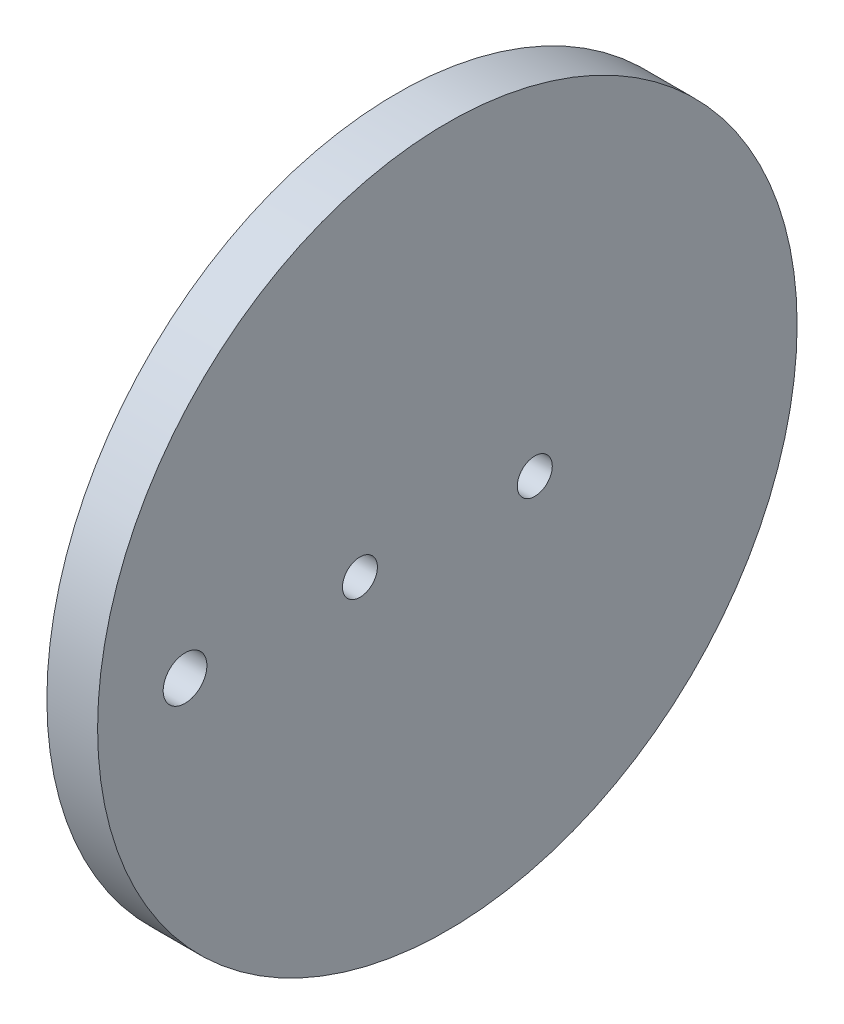
ISO-10303-21;
HEADER;
FILE_DESCRIPTION(('STEP AP214'),'2;1');
FILE_NAME('part.step','',(''),(''),'','','');
FILE_SCHEMA(('AUTOMOTIVE_DESIGN { 1 0 10303 214 1 1 1 1 }'));
ENDSEC;
DATA;
#1=APPLICATION_CONTEXT('core data for automotive mechanical design processes');
#2=APPLICATION_PROTOCOL_DEFINITION('international standard','automotive_design',2000,#1);
#3=PRODUCT_CONTEXT('',#1,'mechanical');
#4=PRODUCT('Part','Part','',(#3));
#5=PRODUCT_RELATED_PRODUCT_CATEGORY('part','',(#4));
#6=PRODUCT_DEFINITION_FORMATION('','',#4);
#7=PRODUCT_DEFINITION_CONTEXT('part definition',#1,'design');
#8=PRODUCT_DEFINITION('design','',#6,#7);
#9=PRODUCT_DEFINITION_SHAPE('','',#8);
#10=(LENGTH_UNIT() NAMED_UNIT(*) SI_UNIT(.MILLI.,.METRE.));
#11=(NAMED_UNIT(*) PLANE_ANGLE_UNIT() SI_UNIT($,.RADIAN.));
#12=(NAMED_UNIT(*) SI_UNIT($,.STERADIAN.) SOLID_ANGLE_UNIT());
#13=UNCERTAINTY_MEASURE_WITH_UNIT(LENGTH_MEASURE(1.E-05),#10,'distance_accuracy_value','');
#14=(GEOMETRIC_REPRESENTATION_CONTEXT(3) GLOBAL_UNCERTAINTY_ASSIGNED_CONTEXT((#13)) GLOBAL_UNIT_ASSIGNED_CONTEXT((#10,
#11,#12)) REPRESENTATION_CONTEXT('',''));
#15=CARTESIAN_POINT('',(0.,0.,0.));
#16=DIRECTION('',(0.,0.,1.));
#17=DIRECTION('',(1.,0.,0.));
#18=AXIS2_PLACEMENT_3D('',#15,#16,#17);
#19=CARTESIAN_POINT('',(5.8,0.,0.));
#20=DIRECTION('',(-1.,0.,0.));
#21=DIRECTION('',(0.,0.,1.));
#22=AXIS2_PLACEMENT_3D('',#19,#20,#21);
#23=CYLINDRICAL_SURFACE('',#22,40.);
#24=CARTESIAN_POINT('',(5.8,0.,0.));
#25=DIRECTION('',(1.,0.,0.));
#26=DIRECTION('',(0.,0.,-1.));
#27=AXIS2_PLACEMENT_3D('',#24,#25,#26);
#28=CIRCLE('',#27,40.);
#29=CARTESIAN_POINT('',(5.8,0.,-40.));
#30=VERTEX_POINT('',#29);
#31=EDGE_CURVE('E10',#30,#30,#28,.T.);
#32=ORIENTED_EDGE('',*,*,#31,.F.);
#33=EDGE_LOOP('',(#32));
#34=FACE_BOUND('',#33,.T.);
#35=CARTESIAN_POINT('',(0.,0.,0.));
#36=DIRECTION('',(1.,0.,0.));
#37=DIRECTION('',(0.,0.,-1.));
#38=AXIS2_PLACEMENT_3D('',#35,#36,#37);
#39=CIRCLE('',#38,40.);
#40=CARTESIAN_POINT('',(0.,0.,-40.));
#41=VERTEX_POINT('',#40);
#42=EDGE_CURVE('E38',#41,#41,#39,.T.);
#43=ORIENTED_EDGE('',*,*,#42,.T.);
#44=EDGE_LOOP('',(#43));
#45=FACE_BOUND('',#44,.T.);
#46=ADVANCED_FACE('F35',(#34,#45),#23,.T.);
#47=CARTESIAN_POINT('',(5.8,0.,0.));
#48=DIRECTION('',(1.,0.,0.));
#49=DIRECTION('',(0.,0.,-1.));
#50=AXIS2_PLACEMENT_3D('',#47,#48,#49);
#51=PLANE('',#50);
#52=CARTESIAN_POINT('',(5.8,0.,-10.));
#53=DIRECTION('',(1.,0.,0.));
#54=DIRECTION('',(0.,0.,-1.));
#55=AXIS2_PLACEMENT_3D('',#52,#53,#54);
#56=CIRCLE('',#55,2.);
#57=CARTESIAN_POINT('',(5.8,0.,-12.));
#58=VERTEX_POINT('',#57);
#59=EDGE_CURVE('E59',#58,#58,#56,.T.);
#60=ORIENTED_EDGE('',*,*,#59,.F.);
#61=EDGE_LOOP('',(#60));
#62=FACE_BOUND('',#61,.T.);
#63=CARTESIAN_POINT('',(5.8,0.,10.));
#64=DIRECTION('',(1.,0.,0.));
#65=DIRECTION('',(0.,0.,1.));
#66=AXIS2_PLACEMENT_3D('',#63,#64,#65);
#67=CIRCLE('',#66,2.);
#68=CARTESIAN_POINT('',(5.8,0.,12.));
#69=VERTEX_POINT('',#68);
#70=EDGE_CURVE('E53',#69,#69,#67,.T.);
#71=ORIENTED_EDGE('',*,*,#70,.F.);
#72=EDGE_LOOP('',(#71));
#73=FACE_BOUND('',#72,.T.);
#74=CARTESIAN_POINT('',(5.8,0.,30.));
#75=DIRECTION('',(1.,0.,0.));
#76=DIRECTION('',(0.,0.,-1.));
#77=AXIS2_PLACEMENT_3D('',#74,#75,#76);
#78=CIRCLE('',#77,2.5);
#79=CARTESIAN_POINT('',(5.8,0.,27.5));
#80=VERTEX_POINT('',#79);
#81=EDGE_CURVE('E47',#80,#80,#78,.T.);
#82=ORIENTED_EDGE('',*,*,#81,.F.);
#83=EDGE_LOOP('',(#82));
#84=FACE_BOUND('',#83,.T.);
#85=ORIENTED_EDGE('',*,*,#31,.T.);
#86=EDGE_LOOP('',(#85));
#87=FACE_BOUND('',#86,.T.);
#88=ADVANCED_FACE('F75',(#62,#73,#84,#87),#51,.T.);
#89=CARTESIAN_POINT('',(0.,0.,0.));
#90=DIRECTION('',(1.,0.,0.));
#91=DIRECTION('',(0.,0.,-1.));
#92=AXIS2_PLACEMENT_3D('',#89,#90,#91);
#93=PLANE('',#92);
#94=CARTESIAN_POINT('',(0.,0.,-10.));
#95=DIRECTION('',(1.,0.,0.));
#96=DIRECTION('',(0.,0.,-1.));
#97=AXIS2_PLACEMENT_3D('',#94,#95,#96);
#98=CIRCLE('',#97,2.);
#99=CARTESIAN_POINT('',(0.,0.,-12.));
#100=VERTEX_POINT('',#99);
#101=EDGE_CURVE('E45',#100,#100,#98,.T.);
#102=ORIENTED_EDGE('',*,*,#101,.T.);
#103=EDGE_LOOP('',(#102));
#104=FACE_BOUND('',#103,.T.);
#105=CARTESIAN_POINT('',(0.,0.,10.));
#106=DIRECTION('',(1.,0.,0.));
#107=DIRECTION('',(0.,0.,1.));
#108=AXIS2_PLACEMENT_3D('',#105,#106,#107);
#109=CIRCLE('',#108,2.);
#110=CARTESIAN_POINT('',(0.,0.,12.));
#111=VERTEX_POINT('',#110);
#112=EDGE_CURVE('E56',#111,#111,#109,.T.);
#113=ORIENTED_EDGE('',*,*,#112,.T.);
#114=EDGE_LOOP('',(#113));
#115=FACE_BOUND('',#114,.T.);
#116=CARTESIAN_POINT('',(0.,0.,30.));
#117=DIRECTION('',(1.,0.,0.));
#118=DIRECTION('',(0.,0.,-1.));
#119=AXIS2_PLACEMENT_3D('',#116,#117,#118);
#120=CIRCLE('',#119,2.5);
#121=CARTESIAN_POINT('',(0.,0.,27.5));
#122=VERTEX_POINT('',#121);
#123=EDGE_CURVE('E50',#122,#122,#120,.T.);
#124=ORIENTED_EDGE('',*,*,#123,.T.);
#125=EDGE_LOOP('',(#124));
#126=FACE_BOUND('',#125,.T.);
#127=ORIENTED_EDGE('',*,*,#42,.F.);
#128=EDGE_LOOP('',(#127));
#129=FACE_BOUND('',#128,.T.);
#130=ADVANCED_FACE('F65',(#104,#115,#126,#129),#93,.F.);
#131=CARTESIAN_POINT('',(0.,0.,30.));
#132=DIRECTION('',(1.,0.,0.));
#133=DIRECTION('',(0.,0.,-1.));
#134=AXIS2_PLACEMENT_3D('',#131,#132,#133);
#135=CYLINDRICAL_SURFACE('',#134,2.5);
#136=ORIENTED_EDGE('',*,*,#123,.F.);
#137=EDGE_LOOP('',(#136));
#138=FACE_BOUND('',#137,.T.);
#139=ORIENTED_EDGE('',*,*,#81,.T.);
#140=EDGE_LOOP('',(#139));
#141=FACE_BOUND('',#140,.T.);
#142=ADVANCED_FACE('F83',(#138,#141),#135,.F.);
#143=CARTESIAN_POINT('',(0.,0.,10.));
#144=DIRECTION('',(1.,0.,0.));
#145=DIRECTION('',(0.,0.,-1.));
#146=AXIS2_PLACEMENT_3D('',#143,#144,#145);
#147=CYLINDRICAL_SURFACE('',#146,2.);
#148=ORIENTED_EDGE('',*,*,#112,.F.);
#149=EDGE_LOOP('',(#148));
#150=FACE_BOUND('',#149,.T.);
#151=ORIENTED_EDGE('',*,*,#70,.T.);
#152=EDGE_LOOP('',(#151));
#153=FACE_BOUND('',#152,.T.);
#154=ADVANCED_FACE('F71',(#150,#153),#147,.F.);
#155=CARTESIAN_POINT('',(0.,0.,-10.));
#156=DIRECTION('',(1.,0.,0.));
#157=DIRECTION('',(0.,0.,-1.));
#158=AXIS2_PLACEMENT_3D('',#155,#156,#157);
#159=CYLINDRICAL_SURFACE('',#158,2.);
#160=ORIENTED_EDGE('',*,*,#101,.F.);
#161=EDGE_LOOP('',(#160));
#162=FACE_BOUND('',#161,.T.);
#163=ORIENTED_EDGE('',*,*,#59,.T.);
#164=EDGE_LOOP('',(#163));
#165=FACE_BOUND('',#164,.T.);
#166=ADVANCED_FACE('F68',(#162,#165),#159,.F.);
#167=CLOSED_SHELL('',(#46,#88,#130,#142,#154,#166));
#168=MANIFOLD_SOLID_BREP('B2',#167);
#169=ADVANCED_BREP_SHAPE_REPRESENTATION('',(#18,#168),#14);
#170=SHAPE_DEFINITION_REPRESENTATION(#9,#169);
ENDSEC;
END-ISO-10303-21;
